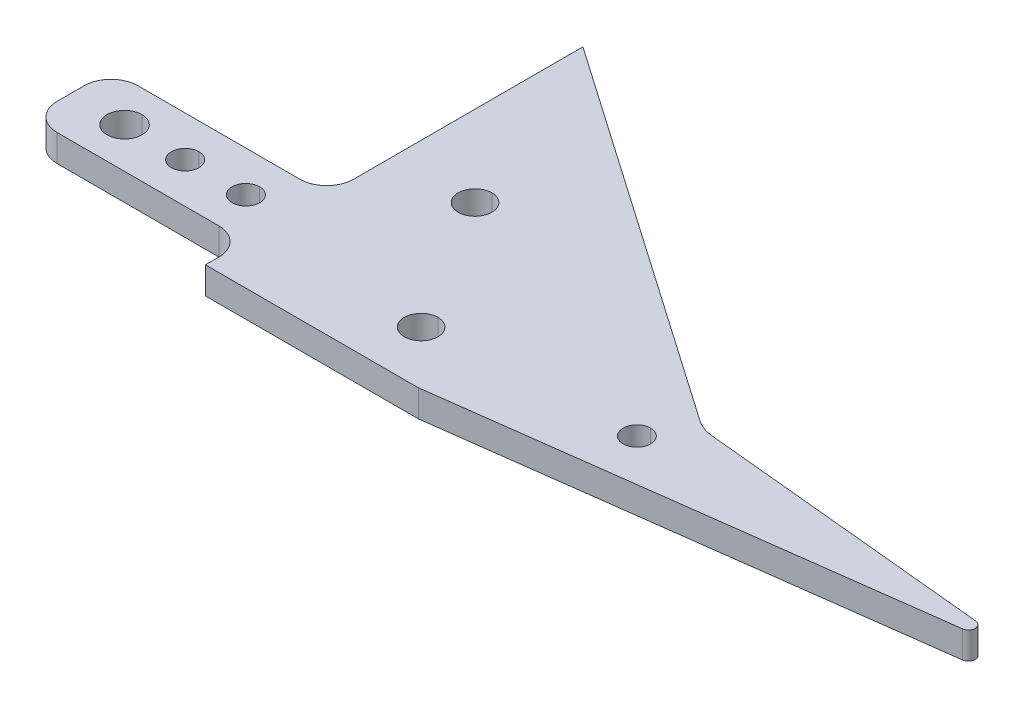
ISO-10303-21;
HEADER;
FILE_DESCRIPTION(('STEP AP214'),'2;1');
FILE_NAME('part.step','',(''),(''),'','','');
FILE_SCHEMA(('AUTOMOTIVE_DESIGN { 1 0 10303 214 1 1 1 1 }'));
ENDSEC;
DATA;
#1=APPLICATION_CONTEXT('core data for automotive mechanical design processes');
#2=APPLICATION_PROTOCOL_DEFINITION('international standard','automotive_design',2000,#1);
#3=PRODUCT_CONTEXT('',#1,'mechanical');
#4=PRODUCT('Part','Part','',(#3));
#5=PRODUCT_RELATED_PRODUCT_CATEGORY('part','',(#4));
#6=PRODUCT_DEFINITION_FORMATION('','',#4);
#7=PRODUCT_DEFINITION_CONTEXT('part definition',#1,'design');
#8=PRODUCT_DEFINITION('design','',#6,#7);
#9=PRODUCT_DEFINITION_SHAPE('','',#8);
#10=(LENGTH_UNIT() NAMED_UNIT(*) SI_UNIT(.MILLI.,.METRE.));
#11=(NAMED_UNIT(*) PLANE_ANGLE_UNIT() SI_UNIT($,.RADIAN.));
#12=(NAMED_UNIT(*) SI_UNIT($,.STERADIAN.) SOLID_ANGLE_UNIT());
#13=UNCERTAINTY_MEASURE_WITH_UNIT(LENGTH_MEASURE(1.E-05),#10,'distance_accuracy_value','');
#14=(GEOMETRIC_REPRESENTATION_CONTEXT(3) GLOBAL_UNCERTAINTY_ASSIGNED_CONTEXT((#13)) GLOBAL_UNIT_ASSIGNED_CONTEXT((#10,
#11,#12)) REPRESENTATION_CONTEXT('',''));
#15=CARTESIAN_POINT('',(0.,0.,0.));
#16=DIRECTION('',(0.,0.,1.));
#17=DIRECTION('',(1.,0.,0.));
#18=AXIS2_PLACEMENT_3D('',#15,#16,#17);
#19=CARTESIAN_POINT('',(43.,0.,-6.));
#20=DIRECTION('',(0.,1.,0.));
#21=DIRECTION('',(0.,0.,1.));
#22=AXIS2_PLACEMENT_3D('',#19,#20,#21);
#23=CYLINDRICAL_SURFACE('',#22,1.25);
#24=DIRECTION('',(0.,1.,0.));
#25=VECTOR('',#24,1.);
#26=CARTESIAN_POINT('',(43.,0.,-7.25));
#27=LINE('',#26,#25);
#28=CARTESIAN_POINT('',(43.,0.,-7.25));
#29=VERTEX_POINT('',#28);
#30=CARTESIAN_POINT('',(43.,2.,-7.25));
#31=VERTEX_POINT('',#30);
#32=EDGE_CURVE('E272',#29,#31,#27,.T.);
#33=ORIENTED_EDGE('',*,*,#32,.F.);
#34=CARTESIAN_POINT('',(43.,0.,-6.));
#35=DIRECTION('',(0.,1.,0.));
#36=DIRECTION('',(0.,0.,1.));
#37=AXIS2_PLACEMENT_3D('',#34,#35,#36);
#38=CIRCLE('',#37,1.25);
#39=CARTESIAN_POINT('',(43.,0.,-4.75));
#40=VERTEX_POINT('',#39);
#41=EDGE_CURVE('E259',#40,#29,#38,.T.);
#42=ORIENTED_EDGE('',*,*,#41,.F.);
#43=DIRECTION('',(0.,1.,0.));
#44=VECTOR('',#43,1.);
#45=CARTESIAN_POINT('',(43.,0.,-4.75));
#46=LINE('',#45,#44);
#47=CARTESIAN_POINT('',(43.,2.,-4.75));
#48=VERTEX_POINT('',#47);
#49=EDGE_CURVE('E281',#40,#48,#46,.T.);
#50=ORIENTED_EDGE('',*,*,#49,.T.);
#51=CARTESIAN_POINT('',(43.,2.,-6.));
#52=DIRECTION('',(0.,1.,0.));
#53=DIRECTION('',(0.,0.,1.));
#54=AXIS2_PLACEMENT_3D('',#51,#52,#53);
#55=CIRCLE('',#54,1.25);
#56=EDGE_CURVE('E273',#48,#31,#55,.T.);
#57=ORIENTED_EDGE('',*,*,#56,.T.);
#58=EDGE_LOOP('',(#33,#42,#50,#57));
#59=FACE_BOUND('',#58,.T.);
#60=ADVANCED_FACE('F16',(#59),#23,.F.);
#61=CARTESIAN_POINT('',(23.5,2.,-8.));
#62=DIRECTION('',(0.,1.,0.));
#63=DIRECTION('',(0.,0.,1.));
#64=AXIS2_PLACEMENT_3D('',#61,#62,#63);
#65=CYLINDRICAL_SURFACE('',#64,1.025);
#66=DIRECTION('',(0.,1.,0.));
#67=VECTOR('',#66,1.);
#68=CARTESIAN_POINT('',(23.5,2.,-9.025));
#69=LINE('',#68,#67);
#70=CARTESIAN_POINT('',(23.5,0.,-9.025));
#71=VERTEX_POINT('',#70);
#72=CARTESIAN_POINT('',(23.5,2.,-9.025));
#73=VERTEX_POINT('',#72);
#74=EDGE_CURVE('E308',#71,#73,#69,.T.);
#75=ORIENTED_EDGE('',*,*,#74,.F.);
#76=CARTESIAN_POINT('',(23.5,0.,-8.));
#77=DIRECTION('',(0.,-1.,0.));
#78=DIRECTION('',(0.,0.,-1.));
#79=AXIS2_PLACEMENT_3D('',#76,#77,#78);
#80=CIRCLE('',#79,1.025);
#81=CARTESIAN_POINT('',(23.5,0.,-6.975));
#82=VERTEX_POINT('',#81);
#83=EDGE_CURVE('E288',#71,#82,#80,.T.);
#84=ORIENTED_EDGE('',*,*,#83,.T.);
#85=DIRECTION('',(0.,1.,0.));
#86=VECTOR('',#85,1.);
#87=CARTESIAN_POINT('',(23.5,2.,-6.975));
#88=LINE('',#87,#86);
#89=CARTESIAN_POINT('',(23.5,2.,-6.975));
#90=VERTEX_POINT('',#89);
#91=EDGE_CURVE('E307',#82,#90,#88,.T.);
#92=ORIENTED_EDGE('',*,*,#91,.T.);
#93=CARTESIAN_POINT('',(23.5,2.,-8.));
#94=DIRECTION('',(0.,1.,0.));
#95=DIRECTION('',(0.,0.,1.));
#96=AXIS2_PLACEMENT_3D('',#93,#94,#95);
#97=CIRCLE('',#96,1.02499999999999);
#98=EDGE_CURVE('E480',#90,#73,#97,.T.);
#99=ORIENTED_EDGE('',*,*,#98,.T.);
#100=EDGE_LOOP('',(#75,#84,#92,#99));
#101=FACE_BOUND('',#100,.T.);
#102=ADVANCED_FACE('F627',(#101),#65,.F.);
#103=CARTESIAN_POINT('',(19.,-8.,-8.));
#104=DIRECTION('',(0.,1.,0.));
#105=DIRECTION('',(0.,0.,1.));
#106=AXIS2_PLACEMENT_3D('',#103,#104,#105);
#107=CYLINDRICAL_SURFACE('',#106,1.3);
#108=DIRECTION('',(0.,1.,0.));
#109=VECTOR('',#108,1.);
#110=CARTESIAN_POINT('',(19.,-8.,-9.3));
#111=LINE('',#110,#109);
#112=CARTESIAN_POINT('',(19.,0.,-9.3));
#113=VERTEX_POINT('',#112);
#114=CARTESIAN_POINT('',(19.,2.,-9.3));
#115=VERTEX_POINT('',#114);
#116=EDGE_CURVE('E361',#113,#115,#111,.T.);
#117=ORIENTED_EDGE('',*,*,#116,.F.);
#118=CARTESIAN_POINT('',(19.,0.,-8.));
#119=DIRECTION('',(0.,-1.,0.));
#120=DIRECTION('',(0.,0.,-1.));
#121=AXIS2_PLACEMENT_3D('',#118,#119,#120);
#122=CIRCLE('',#121,1.3);
#123=CARTESIAN_POINT('',(19.,0.,-6.7));
#124=VERTEX_POINT('',#123);
#125=EDGE_CURVE('E291',#113,#124,#122,.T.);
#126=ORIENTED_EDGE('',*,*,#125,.T.);
#127=DIRECTION('',(0.,1.,0.));
#128=VECTOR('',#127,1.);
#129=CARTESIAN_POINT('',(19.,-8.,-6.7));
#130=LINE('',#129,#128);
#131=CARTESIAN_POINT('',(19.,2.,-6.7));
#132=VERTEX_POINT('',#131);
#133=EDGE_CURVE('E330',#124,#132,#130,.T.);
#134=ORIENTED_EDGE('',*,*,#133,.T.);
#135=CARTESIAN_POINT('',(19.,2.,-8.));
#136=DIRECTION('',(0.,1.,0.));
#137=DIRECTION('',(0.,0.,1.));
#138=AXIS2_PLACEMENT_3D('',#135,#136,#137);
#139=CIRCLE('',#138,1.3);
#140=EDGE_CURVE('E483',#132,#115,#139,.T.);
#141=ORIENTED_EDGE('',*,*,#140,.T.);
#142=EDGE_LOOP('',(#117,#126,#134,#141));
#143=FACE_BOUND('',#142,.T.);
#144=ADVANCED_FACE('F631',(#143),#107,.F.);
#145=CARTESIAN_POINT('',(61.063887788256,2.,-12.7905388234197));
#146=DIRECTION('',(0.,1.,0.));
#147=DIRECTION('',(0.,0.,1.));
#148=AXIS2_PLACEMENT_3D('',#145,#146,#147);
#149=CYLINDRICAL_SURFACE('',#148,3.);
#150=CARTESIAN_POINT('',(61.063887788256,2.,-12.7905388234197));
#151=DIRECTION('',(0.,-1.,0.));
#152=DIRECTION('',(0.,0.,-1.));
#153=AXIS2_PLACEMENT_3D('',#150,#151,#152);
#154=CIRCLE('',#153,3.);
#155=CARTESIAN_POINT('',(60.7726376251566,2.,-9.80471007037729));
#156=VERTEX_POINT('',#155);
#157=CARTESIAN_POINT('',(59.3536273564194,2.,-10.3257854371163));
#158=VERTEX_POINT('',#157);
#159=EDGE_CURVE('E463',#156,#158,#154,.T.);
#160=ORIENTED_EDGE('',*,*,#159,.F.);
#161=DIRECTION('',(0.,1.,0.));
#162=VECTOR('',#161,1.);
#163=CARTESIAN_POINT('',(60.7726376251566,2.,-9.80471007037729));
#164=LINE('',#163,#162);
#165=CARTESIAN_POINT('',(60.7726376251566,0.,-9.80471007037729));
#166=VERTEX_POINT('',#165);
#167=EDGE_CURVE('E25',#166,#156,#164,.T.);
#168=ORIENTED_EDGE('',*,*,#167,.F.);
#169=CARTESIAN_POINT('',(61.063887788256,0.,-12.7905388234197));
#170=DIRECTION('',(0.,1.,0.));
#171=DIRECTION('',(0.,0.,-1.));
#172=AXIS2_PLACEMENT_3D('',#169,#170,#171);
#173=CIRCLE('',#172,3.);
#174=CARTESIAN_POINT('',(59.3536273564194,0.,-10.3257854371163));
#175=VERTEX_POINT('',#174);
#176=EDGE_CURVE('E292',#175,#166,#173,.T.);
#177=ORIENTED_EDGE('',*,*,#176,.F.);
#178=DIRECTION('',(0.,-1.,0.));
#179=VECTOR('',#178,1.);
#180=CARTESIAN_POINT('',(59.3536273564194,0.,-10.3257854371163));
#181=LINE('',#180,#179);
#182=EDGE_CURVE('E410',#158,#175,#181,.T.);
#183=ORIENTED_EDGE('',*,*,#182,.F.);
#184=EDGE_LOOP('',(#160,#168,#177,#183));
#185=FACE_BOUND('',#184,.T.);
#186=ADVANCED_FACE('F601',(#185),#149,.F.);
#187=CARTESIAN_POINT('',(82.4056334382696,31.0427436613577,-7.19216454145171));
#188=DIRECTION('',(0.,-1.,0.));
#189=DIRECTION('',(0.,0.,-1.));
#190=AXIS2_PLACEMENT_3D('',#187,#188,#189);
#191=CYLINDRICAL_SURFACE('',#190,0.5);
#192=CARTESIAN_POINT('',(82.4056334382696,2.,-7.19216454145171));
#193=DIRECTION('',(0.,1.,0.));
#194=DIRECTION('',(0.,0.,-1.));
#195=AXIS2_PLACEMENT_3D('',#192,#193,#194);
#196=CIRCLE('',#195,0.5);
#197=CARTESIAN_POINT('',(82.4708965343796,2.,-6.6964421107648));
#198=VERTEX_POINT('',#197);
#199=CARTESIAN_POINT('',(82.4541751321195,2.,-7.68980266695877));
#200=VERTEX_POINT('',#199);
#201=EDGE_CURVE('E445',#198,#200,#196,.T.);
#202=ORIENTED_EDGE('',*,*,#201,.F.);
#203=DIRECTION('',(0.,1.,0.));
#204=VECTOR('',#203,1.);
#205=CARTESIAN_POINT('',(82.4708965343796,2.,-6.69644211076481));
#206=LINE('',#205,#204);
#207=CARTESIAN_POINT('',(82.4708965343796,0.,-6.6964421107648));
#208=VERTEX_POINT('',#207);
#209=EDGE_CURVE('E510',#208,#198,#206,.T.);
#210=ORIENTED_EDGE('',*,*,#209,.F.);
#211=CARTESIAN_POINT('',(82.4056334382696,0.,-7.19216454145171));
#212=DIRECTION('',(0.,-1.,0.));
#213=DIRECTION('',(0.,0.,-1.));
#214=AXIS2_PLACEMENT_3D('',#211,#212,#213);
#215=CIRCLE('',#214,0.5);
#216=CARTESIAN_POINT('',(82.4541751321195,0.,-7.68980266695877));
#217=VERTEX_POINT('',#216);
#218=EDGE_CURVE('E522',#217,#208,#215,.T.);
#219=ORIENTED_EDGE('',*,*,#218,.F.);
#220=DIRECTION('',(0.,-1.,0.));
#221=VECTOR('',#220,1.);
#222=CARTESIAN_POINT('',(82.4541751321195,31.0427436613577,-7.68980266695877));
#223=LINE('',#222,#221);
#224=EDGE_CURVE('E11',#200,#217,#223,.T.);
#225=ORIENTED_EDGE('',*,*,#224,.F.);
#226=EDGE_LOOP('',(#202,#210,#219,#225));
#227=FACE_BOUND('',#226,.T.);
#228=ADVANCED_FACE('F595',(#227),#191,.T.);
#229=CARTESIAN_POINT('',(1.52017135493674,31.0427436613577,-15.5844422293835));
#230=DIRECTION('',(-0.0970833876998076,0.,0.995276251014124));
#231=DIRECTION('',(0.,1.,0.));
#232=AXIS2_PLACEMENT_3D('',#229,#230,#231);
#233=PLANE('',#232);
#234=DIRECTION('',(-0.995276251014124,0.,-0.0970833876998076));
#235=VECTOR('',#234,1.);
#236=CARTESIAN_POINT('',(1.52017135493674,0.,-15.5844422293835));
#237=LINE('',#236,#235);
#238=EDGE_CURVE('E518',#217,#166,#237,.T.);
#239=ORIENTED_EDGE('',*,*,#238,.T.);
#240=ORIENTED_EDGE('',*,*,#167,.T.);
#241=DIRECTION('',(0.995276251014124,0.,0.0970833876998076));
#242=VECTOR('',#241,1.);
#243=CARTESIAN_POINT('',(1.52017135493674,2.,-15.5844422293835));
#244=LINE('',#243,#242);
#245=EDGE_CURVE('E449',#156,#200,#244,.T.);
#246=ORIENTED_EDGE('',*,*,#245,.T.);
#247=ORIENTED_EDGE('',*,*,#224,.T.);
#248=EDGE_LOOP('',(#239,#240,#246,#247));
#249=FACE_BOUND('',#248,.T.);
#250=ADVANCED_FACE('F599',(#249),#233,.F.);
#251=CARTESIAN_POINT('',(28.,0.,-8.));
#252=DIRECTION('',(0.,-1.,0.));
#253=DIRECTION('',(0.,0.,-1.));
#254=AXIS2_PLACEMENT_3D('',#251,#252,#253);
#255=CYLINDRICAL_SURFACE('',#254,1.025);
#256=DIRECTION('',(0.,-1.,0.));
#257=VECTOR('',#256,1.);
#258=CARTESIAN_POINT('',(28.,0.,-6.975));
#259=LINE('',#258,#257);
#260=CARTESIAN_POINT('',(28.,2.,-6.975));
#261=VERTEX_POINT('',#260);
#262=CARTESIAN_POINT('',(28.,0.,-6.975));
#263=VERTEX_POINT('',#262);
#264=EDGE_CURVE('E329',#261,#263,#259,.T.);
#265=ORIENTED_EDGE('',*,*,#264,.F.);
#266=CARTESIAN_POINT('',(28.,2.,-8.));
#267=DIRECTION('',(0.,-1.,0.));
#268=DIRECTION('',(0.,0.,-1.));
#269=AXIS2_PLACEMENT_3D('',#266,#267,#268);
#270=CIRCLE('',#269,1.025);
#271=CARTESIAN_POINT('',(28.,2.,-9.025));
#272=VERTEX_POINT('',#271);
#273=EDGE_CURVE('E495',#272,#261,#270,.T.);
#274=ORIENTED_EDGE('',*,*,#273,.F.);
#275=DIRECTION('',(0.,-1.,0.));
#276=VECTOR('',#275,1.);
#277=CARTESIAN_POINT('',(28.,0.,-9.025));
#278=LINE('',#277,#276);
#279=CARTESIAN_POINT('',(28.,0.,-9.025));
#280=VERTEX_POINT('',#279);
#281=EDGE_CURVE('E338',#272,#280,#278,.T.);
#282=ORIENTED_EDGE('',*,*,#281,.T.);
#283=CARTESIAN_POINT('',(28.,0.,-8.));
#284=DIRECTION('',(0.,-1.,0.));
#285=DIRECTION('',(0.,0.,-1.));
#286=AXIS2_PLACEMENT_3D('',#283,#284,#285);
#287=CIRCLE('',#286,1.025);
#288=EDGE_CURVE('E540',#280,#263,#287,.T.);
#289=ORIENTED_EDGE('',*,*,#288,.T.);
#290=EDGE_LOOP('',(#265,#274,#282,#289));
#291=FACE_BOUND('',#290,.T.);
#292=ADVANCED_FACE('F646',(#291),#255,.F.);
#293=CARTESIAN_POINT('',(29.,19.0880074906351,-13.));
#294=DIRECTION('',(0.,-1.,0.));
#295=DIRECTION('',(0.,0.,-1.));
#296=AXIS2_PLACEMENT_3D('',#293,#294,#295);
#297=CYLINDRICAL_SURFACE('',#296,2.);
#298=CARTESIAN_POINT('',(29.,2.,-13.));
#299=DIRECTION('',(0.,-1.,0.));
#300=DIRECTION('',(0.,0.,-1.));
#301=AXIS2_PLACEMENT_3D('',#298,#299,#300);
#302=CIRCLE('',#301,2.);
#303=CARTESIAN_POINT('',(31.,2.,-13.));
#304=VERTEX_POINT('',#303);
#305=CARTESIAN_POINT('',(29.,2.,-11.));
#306=VERTEX_POINT('',#305);
#307=EDGE_CURVE('E459',#304,#306,#302,.T.);
#308=ORIENTED_EDGE('',*,*,#307,.F.);
#309=DIRECTION('',(0.,1.,0.));
#310=VECTOR('',#309,1.);
#311=CARTESIAN_POINT('',(31.,1.,-13.));
#312=LINE('',#311,#310);
#313=CARTESIAN_POINT('',(31.,0.,-13.));
#314=VERTEX_POINT('',#313);
#315=EDGE_CURVE('E389',#314,#304,#312,.T.);
#316=ORIENTED_EDGE('',*,*,#315,.F.);
#317=CARTESIAN_POINT('',(29.,0.,-13.));
#318=DIRECTION('',(0.,1.,0.));
#319=DIRECTION('',(0.,0.,-1.));
#320=AXIS2_PLACEMENT_3D('',#317,#318,#319);
#321=CIRCLE('',#320,2.);
#322=CARTESIAN_POINT('',(29.,0.,-11.));
#323=VERTEX_POINT('',#322);
#324=EDGE_CURVE('E293',#323,#314,#321,.T.);
#325=ORIENTED_EDGE('',*,*,#324,.F.);
#326=DIRECTION('',(0.,-1.,0.));
#327=VECTOR('',#326,1.);
#328=CARTESIAN_POINT('',(29.,19.0880074906351,-11.));
#329=LINE('',#328,#327);
#330=EDGE_CURVE('E39',#306,#323,#329,.T.);
#331=ORIENTED_EDGE('',*,*,#330,.F.);
#332=EDGE_LOOP('',(#308,#316,#325,#331));
#333=FACE_BOUND('',#332,.T.);
#334=ADVANCED_FACE('F613',(#333),#297,.F.);
#335=CARTESIAN_POINT('',(29.,1.,-3.));
#336=DIRECTION('',(0.,-1.,0.));
#337=DIRECTION('',(0.,0.,-1.));
#338=AXIS2_PLACEMENT_3D('',#335,#336,#337);
#339=CYLINDRICAL_SURFACE('',#338,2.);
#340=CARTESIAN_POINT('',(29.,2.,-3.));
#341=DIRECTION('',(0.,-1.,0.));
#342=DIRECTION('',(0.,0.,-1.));
#343=AXIS2_PLACEMENT_3D('',#340,#341,#342);
#344=CIRCLE('',#343,2.);
#345=CARTESIAN_POINT('',(29.,2.,-5.));
#346=VERTEX_POINT('',#345);
#347=CARTESIAN_POINT('',(31.,2.,-3.));
#348=VERTEX_POINT('',#347);
#349=EDGE_CURVE('E351',#346,#348,#344,.T.);
#350=ORIENTED_EDGE('',*,*,#349,.F.);
#351=DIRECTION('',(0.,1.,0.));
#352=VECTOR('',#351,1.);
#353=CARTESIAN_POINT('',(29.,19.0880074906351,-5.));
#354=LINE('',#353,#352);
#355=CARTESIAN_POINT('',(29.,0.,-5.));
#356=VERTEX_POINT('',#355);
#357=EDGE_CURVE('E19',#356,#346,#354,.T.);
#358=ORIENTED_EDGE('',*,*,#357,.F.);
#359=CARTESIAN_POINT('',(29.,0.,-3.));
#360=DIRECTION('',(0.,1.,0.));
#361=DIRECTION('',(0.,0.,-1.));
#362=AXIS2_PLACEMENT_3D('',#359,#360,#361);
#363=CIRCLE('',#362,2.);
#364=CARTESIAN_POINT('',(31.,0.,-3.));
#365=VERTEX_POINT('',#364);
#366=EDGE_CURVE('E409',#365,#356,#363,.T.);
#367=ORIENTED_EDGE('',*,*,#366,.F.);
#368=DIRECTION('',(0.,-1.,0.));
#369=VECTOR('',#368,1.);
#370=CARTESIAN_POINT('',(31.,1.,-3.));
#371=LINE('',#370,#369);
#372=EDGE_CURVE('E297',#348,#365,#371,.T.);
#373=ORIENTED_EDGE('',*,*,#372,.F.);
#374=EDGE_LOOP('',(#350,#358,#367,#373));
#375=FACE_BOUND('',#374,.T.);
#376=ADVANCED_FACE('F581',(#375),#339,.F.);
#377=CARTESIAN_POINT('',(17.,19.0880074906351,-7.));
#378=DIRECTION('',(0.,-1.,0.));
#379=DIRECTION('',(0.,0.,-1.));
#380=AXIS2_PLACEMENT_3D('',#377,#378,#379);
#381=CYLINDRICAL_SURFACE('',#380,2.);
#382=CARTESIAN_POINT('',(17.,2.,-7.));
#383=DIRECTION('',(0.,1.,0.));
#384=DIRECTION('',(0.,0.,-1.));
#385=AXIS2_PLACEMENT_3D('',#382,#383,#384);
#386=CIRCLE('',#385,2.);
#387=CARTESIAN_POINT('',(15.,2.,-7.));
#388=VERTEX_POINT('',#387);
#389=CARTESIAN_POINT('',(17.,2.,-5.));
#390=VERTEX_POINT('',#389);
#391=EDGE_CURVE('E352',#388,#390,#386,.T.);
#392=ORIENTED_EDGE('',*,*,#391,.F.);
#393=DIRECTION('',(0.,1.,0.));
#394=VECTOR('',#393,1.);
#395=CARTESIAN_POINT('',(15.,19.0880074906351,-7.));
#396=LINE('',#395,#394);
#397=CARTESIAN_POINT('',(15.,0.,-7.));
#398=VERTEX_POINT('',#397);
#399=EDGE_CURVE('E530',#398,#388,#396,.T.);
#400=ORIENTED_EDGE('',*,*,#399,.F.);
#401=CARTESIAN_POINT('',(17.,0.,-7.));
#402=DIRECTION('',(0.,-1.,0.));
#403=DIRECTION('',(0.,0.,-1.));
#404=AXIS2_PLACEMENT_3D('',#401,#402,#403);
#405=CIRCLE('',#404,2.);
#406=CARTESIAN_POINT('',(17.,0.,-5.));
#407=VERTEX_POINT('',#406);
#408=EDGE_CURVE('E408',#407,#398,#405,.T.);
#409=ORIENTED_EDGE('',*,*,#408,.F.);
#410=DIRECTION('',(0.,-1.,0.));
#411=VECTOR('',#410,1.);
#412=CARTESIAN_POINT('',(17.,19.0880074906351,-5.));
#413=LINE('',#412,#411);
#414=EDGE_CURVE('E534',#390,#407,#413,.T.);
#415=ORIENTED_EDGE('',*,*,#414,.F.);
#416=EDGE_LOOP('',(#392,#400,#409,#415));
#417=FACE_BOUND('',#416,.T.);
#418=ADVANCED_FACE('F566',(#417),#381,.T.);
#419=CARTESIAN_POINT('',(17.,19.0880074906351,-9.));
#420=DIRECTION('',(0.,-1.,0.));
#421=DIRECTION('',(0.,0.,-1.));
#422=AXIS2_PLACEMENT_3D('',#419,#420,#421);
#423=CYLINDRICAL_SURFACE('',#422,2.);
#424=CARTESIAN_POINT('',(17.,2.,-9.));
#425=DIRECTION('',(0.,1.,0.));
#426=DIRECTION('',(0.,0.,-1.));
#427=AXIS2_PLACEMENT_3D('',#424,#425,#426);
#428=CIRCLE('',#427,2.);
#429=CARTESIAN_POINT('',(17.,2.,-11.));
#430=VERTEX_POINT('',#429);
#431=CARTESIAN_POINT('',(15.,2.,-9.));
#432=VERTEX_POINT('',#431);
#433=EDGE_CURVE('E458',#430,#432,#428,.T.);
#434=ORIENTED_EDGE('',*,*,#433,.F.);
#435=DIRECTION('',(0.,1.,0.));
#436=VECTOR('',#435,1.);
#437=CARTESIAN_POINT('',(17.,19.0880074906351,-11.));
#438=LINE('',#437,#436);
#439=CARTESIAN_POINT('',(17.,0.,-11.));
#440=VERTEX_POINT('',#439);
#441=EDGE_CURVE('E50',#440,#430,#438,.T.);
#442=ORIENTED_EDGE('',*,*,#441,.F.);
#443=CARTESIAN_POINT('',(17.,0.,-9.));
#444=DIRECTION('',(0.,-1.,0.));
#445=DIRECTION('',(0.,0.,-1.));
#446=AXIS2_PLACEMENT_3D('',#443,#444,#445);
#447=CIRCLE('',#446,2.);
#448=CARTESIAN_POINT('',(15.,0.,-9.));
#449=VERTEX_POINT('',#448);
#450=EDGE_CURVE('E365',#449,#440,#447,.T.);
#451=ORIENTED_EDGE('',*,*,#450,.F.);
#452=DIRECTION('',(0.,-1.,0.));
#453=VECTOR('',#452,1.);
#454=CARTESIAN_POINT('',(15.,19.0880074906351,-9.));
#455=LINE('',#454,#453);
#456=EDGE_CURVE('E527',#432,#449,#455,.T.);
#457=ORIENTED_EDGE('',*,*,#456,.F.);
#458=EDGE_LOOP('',(#434,#442,#451,#457));
#459=FACE_BOUND('',#458,.T.);
#460=ADVANCED_FACE('F570',(#459),#423,.T.);
#461=CARTESIAN_POINT('',(31.,19.0880074906351,-5.));
#462=DIRECTION('',(0.,0.,1.));
#463=DIRECTION('',(1.,0.,0.));
#464=AXIS2_PLACEMENT_3D('',#461,#462,#463);
#465=PLANE('',#464);
#466=DIRECTION('',(1.,0.,0.));
#467=VECTOR('',#466,1.);
#468=CARTESIAN_POINT('',(31.,2.,-5.));
#469=LINE('',#468,#467);
#470=EDGE_CURVE('E347',#390,#346,#469,.T.);
#471=ORIENTED_EDGE('',*,*,#470,.F.);
#472=ORIENTED_EDGE('',*,*,#414,.T.);
#473=DIRECTION('',(-1.,0.,0.));
#474=VECTOR('',#473,1.);
#475=CARTESIAN_POINT('',(31.,0.,-5.));
#476=LINE('',#475,#474);
#477=EDGE_CURVE('E404',#356,#407,#476,.T.);
#478=ORIENTED_EDGE('',*,*,#477,.F.);
#479=ORIENTED_EDGE('',*,*,#357,.T.);
#480=EDGE_LOOP('',(#471,#472,#478,#479));
#481=FACE_BOUND('',#480,.T.);
#482=ADVANCED_FACE('F576',(#481),#465,.T.);
#483=CARTESIAN_POINT('',(15.,19.0880074906351,-5.));
#484=DIRECTION('',(-1.,0.,0.));
#485=DIRECTION('',(0.,0.,1.));
#486=AXIS2_PLACEMENT_3D('',#483,#484,#485);
#487=PLANE('',#486);
#488=DIRECTION('',(0.,0.,1.));
#489=VECTOR('',#488,1.);
#490=CARTESIAN_POINT('',(15.,2.,-5.));
#491=LINE('',#490,#489);
#492=EDGE_CURVE('E476',#432,#388,#491,.T.);
#493=ORIENTED_EDGE('',*,*,#492,.F.);
#494=ORIENTED_EDGE('',*,*,#456,.T.);
#495=DIRECTION('',(0.,0.,-1.));
#496=VECTOR('',#495,1.);
#497=CARTESIAN_POINT('',(15.,0.,-5.));
#498=LINE('',#497,#496);
#499=EDGE_CURVE('E453',#398,#449,#498,.T.);
#500=ORIENTED_EDGE('',*,*,#499,.F.);
#501=ORIENTED_EDGE('',*,*,#399,.T.);
#502=EDGE_LOOP('',(#493,#494,#500,#501));
#503=FACE_BOUND('',#502,.T.);
#504=ADVANCED_FACE('F563',(#503),#487,.T.);
#505=CARTESIAN_POINT('',(31.,19.0880074906351,-11.));
#506=DIRECTION('',(0.,0.,-1.));
#507=DIRECTION('',(0.,-1.,0.));
#508=AXIS2_PLACEMENT_3D('',#505,#506,#507);
#509=PLANE('',#508);
#510=DIRECTION('',(1.,0.,0.));
#511=VECTOR('',#510,1.);
#512=CARTESIAN_POINT('',(31.,0.,-11.));
#513=LINE('',#512,#511);
#514=EDGE_CURVE('E295',#440,#323,#513,.T.);
#515=ORIENTED_EDGE('',*,*,#514,.F.);
#516=ORIENTED_EDGE('',*,*,#441,.T.);
#517=DIRECTION('',(-1.,0.,0.));
#518=VECTOR('',#517,1.);
#519=CARTESIAN_POINT('',(31.,2.,-11.));
#520=LINE('',#519,#518);
#521=EDGE_CURVE('E454',#306,#430,#520,.T.);
#522=ORIENTED_EDGE('',*,*,#521,.F.);
#523=ORIENTED_EDGE('',*,*,#330,.T.);
#524=EDGE_LOOP('',(#515,#516,#522,#523));
#525=FACE_BOUND('',#524,.T.);
#526=ADVANCED_FACE('F614',(#525),#509,.T.);
#527=CARTESIAN_POINT('',(57.7420724848817,8.,-2.));
#528=DIRECTION('',(0.,0.,-1.));
#529=DIRECTION('',(0.,-1.,0.));
#530=AXIS2_PLACEMENT_3D('',#527,#528,#529);
#531=PLANE('',#530);
#532=DIRECTION('',(1.,0.,0.));
#533=VECTOR('',#532,1.);
#534=CARTESIAN_POINT('',(58.,2.,-2.));
#535=LINE('',#534,#533);
#536=CARTESIAN_POINT('',(31.,2.,-2.));
#537=VERTEX_POINT('',#536);
#538=CARTESIAN_POINT('',(46.7978770563626,2.,-2.));
#539=VERTEX_POINT('',#538);
#540=EDGE_CURVE('E484',#537,#539,#535,.T.);
#541=ORIENTED_EDGE('',*,*,#540,.F.);
#542=DIRECTION('',(0.,-1.,0.));
#543=VECTOR('',#542,1.);
#544=CARTESIAN_POINT('',(31.,2.,-2.));
#545=LINE('',#544,#543);
#546=CARTESIAN_POINT('',(31.,0.,-2.));
#547=VERTEX_POINT('',#546);
#548=EDGE_CURVE('E437',#537,#547,#545,.T.);
#549=ORIENTED_EDGE('',*,*,#548,.T.);
#550=DIRECTION('',(1.,0.,0.));
#551=VECTOR('',#550,1.);
#552=CARTESIAN_POINT('',(58.,0.,-2.));
#553=LINE('',#552,#551);
#554=CARTESIAN_POINT('',(46.7978770563625,0.,-2.));
#555=VERTEX_POINT('',#554);
#556=EDGE_CURVE('E433',#547,#555,#553,.T.);
#557=ORIENTED_EDGE('',*,*,#556,.T.);
#558=DIRECTION('',(0.,-1.,0.));
#559=VECTOR('',#558,1.);
#560=CARTESIAN_POINT('',(46.7978770563626,2.,-2.));
#561=LINE('',#560,#559);
#562=EDGE_CURVE('E415',#539,#555,#561,.T.);
#563=ORIENTED_EDGE('',*,*,#562,.F.);
#564=EDGE_LOOP('',(#541,#549,#557,#563));
#565=FACE_BOUND('',#564,.T.);
#566=ADVANCED_FACE('F586',(#565),#531,.F.);
#567=CARTESIAN_POINT('',(58.,-0.53,-7.00498882584149));
#568=DIRECTION('',(0.,1.,0.));
#569=DIRECTION('',(0.,0.,1.));
#570=AXIS2_PLACEMENT_3D('',#567,#568,#569);
#571=CYLINDRICAL_SURFACE('',#570,1.02);
#572=CARTESIAN_POINT('',(58.,0.,-7.00498882584149));
#573=DIRECTION('',(0.,-1.,0.));
#574=DIRECTION('',(0.,0.,-1.));
#575=AXIS2_PLACEMENT_3D('',#572,#573,#574);
#576=CIRCLE('',#575,1.02);
#577=CARTESIAN_POINT('',(58.,0.,-5.98498882584149));
#578=VERTEX_POINT('',#577);
#579=CARTESIAN_POINT('',(58.,0.,-8.02498882584149));
#580=VERTEX_POINT('',#579);
#581=EDGE_CURVE('E269',#578,#580,#576,.T.);
#582=ORIENTED_EDGE('',*,*,#581,.T.);
#583=DIRECTION('',(0.,1.,0.));
#584=VECTOR('',#583,1.);
#585=CARTESIAN_POINT('',(58.,-0.53,-8.02498882584149));
#586=LINE('',#585,#584);
#587=CARTESIAN_POINT('',(58.,2.,-8.02498882584149));
#588=VERTEX_POINT('',#587);
#589=EDGE_CURVE('E324',#580,#588,#586,.T.);
#590=ORIENTED_EDGE('',*,*,#589,.T.);
#591=CARTESIAN_POINT('',(58.,2.,-7.00498882584149));
#592=DIRECTION('',(0.,1.,0.));
#593=DIRECTION('',(0.,0.,1.));
#594=AXIS2_PLACEMENT_3D('',#591,#592,#593);
#595=CIRCLE('',#594,1.02);
#596=CARTESIAN_POINT('',(58.,2.,-5.98498882584149));
#597=VERTEX_POINT('',#596);
#598=EDGE_CURVE('E501',#588,#597,#595,.T.);
#599=ORIENTED_EDGE('',*,*,#598,.T.);
#600=DIRECTION('',(0.,1.,0.));
#601=VECTOR('',#600,1.);
#602=CARTESIAN_POINT('',(58.,-0.53,-5.98498882584149));
#603=LINE('',#602,#601);
#604=EDGE_CURVE('E323',#578,#597,#603,.T.);
#605=ORIENTED_EDGE('',*,*,#604,.F.);
#606=EDGE_LOOP('',(#582,#590,#599,#605));
#607=FACE_BOUND('',#606,.T.);
#608=ADVANCED_FACE('F622',(#607),#571,.F.);
#609=CARTESIAN_POINT('',(37.,-8.,-16.0000000000005));
#610=DIRECTION('',(0.,1.,0.));
#611=DIRECTION('',(0.,0.,1.));
#612=AXIS2_PLACEMENT_3D('',#609,#610,#611);
#613=CYLINDRICAL_SURFACE('',#612,1.25);
#614=CARTESIAN_POINT('',(37.,0.,-16.0000000000005));
#615=DIRECTION('',(0.,-1.,0.));
#616=DIRECTION('',(0.,0.,-1.));
#617=AXIS2_PLACEMENT_3D('',#614,#615,#616);
#618=CIRCLE('',#617,1.25);
#619=CARTESIAN_POINT('',(37.,0.,-14.7500000000005));
#620=VERTEX_POINT('',#619);
#621=CARTESIAN_POINT('',(37.,0.,-17.2500000000005));
#622=VERTEX_POINT('',#621);
#623=EDGE_CURVE('E543',#620,#622,#618,.T.);
#624=ORIENTED_EDGE('',*,*,#623,.T.);
#625=DIRECTION('',(0.,1.,0.));
#626=VECTOR('',#625,1.);
#627=CARTESIAN_POINT('',(37.,-8.,-17.2500000000005));
#628=LINE('',#627,#626);
#629=CARTESIAN_POINT('',(37.,2.,-17.2500000000005));
#630=VERTEX_POINT('',#629);
#631=EDGE_CURVE('E399',#622,#630,#628,.T.);
#632=ORIENTED_EDGE('',*,*,#631,.T.);
#633=CARTESIAN_POINT('',(37.,2.,-16.0000000000005));
#634=DIRECTION('',(0.,1.,0.));
#635=DIRECTION('',(0.,0.,1.));
#636=AXIS2_PLACEMENT_3D('',#633,#634,#635);
#637=CIRCLE('',#636,1.25);
#638=CARTESIAN_POINT('',(37.,2.,-14.7500000000005));
#639=VERTEX_POINT('',#638);
#640=EDGE_CURVE('E497',#630,#639,#637,.T.);
#641=ORIENTED_EDGE('',*,*,#640,.T.);
#642=DIRECTION('',(0.,1.,0.));
#643=VECTOR('',#642,1.);
#644=CARTESIAN_POINT('',(37.,-8.,-14.7500000000005));
#645=LINE('',#644,#643);
#646=EDGE_CURVE('E419',#620,#639,#645,.T.);
#647=ORIENTED_EDGE('',*,*,#646,.F.);
#648=EDGE_LOOP('',(#624,#632,#641,#647));
#649=FACE_BOUND('',#648,.T.);
#650=ADVANCED_FACE('F670',(#649),#613,.F.);
#651=CARTESIAN_POINT('',(58.,0.,7.00498882584149));
#652=DIRECTION('',(0.,-1.,0.));
#653=DIRECTION('',(0.,0.,-1.));
#654=AXIS2_PLACEMENT_3D('',#651,#652,#653);
#655=PLANE('',#654);
#656=ORIENTED_EDGE('',*,*,#41,.T.);
#657=CARTESIAN_POINT('',(43.,0.,-6.));
#658=DIRECTION('',(0.,1.,0.));
#659=DIRECTION('',(0.,0.,1.));
#660=AXIS2_PLACEMENT_3D('',#657,#658,#659);
#661=CIRCLE('',#660,1.25);
#662=EDGE_CURVE('E264',#29,#40,#661,.T.);
#663=ORIENTED_EDGE('',*,*,#662,.T.);
#664=EDGE_LOOP('',(#656,#663));
#665=FACE_BOUND('',#664,.T.);
#666=ORIENTED_EDGE('',*,*,#581,.F.);
#667=CARTESIAN_POINT('',(58.,0.,-7.00498882584149));
#668=DIRECTION('',(0.,-1.,0.));
#669=DIRECTION('',(0.,0.,-1.));
#670=AXIS2_PLACEMENT_3D('',#667,#668,#669);
#671=CIRCLE('',#670,1.02);
#672=EDGE_CURVE('E319',#580,#578,#671,.T.);
#673=ORIENTED_EDGE('',*,*,#672,.F.);
#674=EDGE_LOOP('',(#666,#673));
#675=FACE_BOUND('',#674,.T.);
#676=ORIENTED_EDGE('',*,*,#623,.F.);
#677=CARTESIAN_POINT('',(37.,0.,-16.0000000000005));
#678=DIRECTION('',(0.,-1.,0.));
#679=DIRECTION('',(0.,0.,-1.));
#680=AXIS2_PLACEMENT_3D('',#677,#678,#679);
#681=CIRCLE('',#680,1.25);
#682=EDGE_CURVE('E403',#622,#620,#681,.T.);
#683=ORIENTED_EDGE('',*,*,#682,.F.);
#684=EDGE_LOOP('',(#676,#683));
#685=FACE_BOUND('',#684,.T.);
#686=ORIENTED_EDGE('',*,*,#288,.F.);
#687=CARTESIAN_POINT('',(28.,0.,-8.));
#688=DIRECTION('',(0.,-1.,0.));
#689=DIRECTION('',(0.,0.,-1.));
#690=AXIS2_PLACEMENT_3D('',#687,#688,#689);
#691=CIRCLE('',#690,1.025);
#692=EDGE_CURVE('E343',#263,#280,#691,.T.);
#693=ORIENTED_EDGE('',*,*,#692,.F.);
#694=EDGE_LOOP('',(#686,#693));
#695=FACE_BOUND('',#694,.T.);
#696=CARTESIAN_POINT('',(19.,0.,-8.));
#697=DIRECTION('',(0.,-1.,0.));
#698=DIRECTION('',(0.,0.,-1.));
#699=AXIS2_PLACEMENT_3D('',#696,#697,#698);
#700=CIRCLE('',#699,1.3);
#701=EDGE_CURVE('E337',#124,#113,#700,.T.);
#702=ORIENTED_EDGE('',*,*,#701,.F.);
#703=ORIENTED_EDGE('',*,*,#125,.F.);
#704=EDGE_LOOP('',(#702,#703));
#705=FACE_BOUND('',#704,.T.);
#706=CARTESIAN_POINT('',(23.5,0.,-8.));
#707=DIRECTION('',(0.,-1.,0.));
#708=DIRECTION('',(0.,0.,-1.));
#709=AXIS2_PLACEMENT_3D('',#706,#707,#708);
#710=CIRCLE('',#709,1.025);
#711=EDGE_CURVE('E315',#82,#71,#710,.T.);
#712=ORIENTED_EDGE('',*,*,#711,.F.);
#713=ORIENTED_EDGE('',*,*,#83,.F.);
#714=EDGE_LOOP('',(#712,#713));
#715=FACE_BOUND('',#714,.T.);
#716=ORIENTED_EDGE('',*,*,#238,.F.);
#717=ORIENTED_EDGE('',*,*,#218,.T.);
#718=DIRECTION('',(0.99144486137381,0.,-0.130526192220052));
#719=VECTOR('',#718,1.);
#720=CARTESIAN_POINT('',(43.,0.,-1.5));
#721=LINE('',#720,#719);
#722=EDGE_CURVE('E506',#555,#208,#721,.T.);
#723=ORIENTED_EDGE('',*,*,#722,.F.);
#724=ORIENTED_EDGE('',*,*,#556,.F.);
#725=DIRECTION('',(0.,0.,1.));
#726=VECTOR('',#725,1.);
#727=CARTESIAN_POINT('',(31.,0.,-30.));
#728=LINE('',#727,#726);
#729=EDGE_CURVE('E301',#365,#547,#728,.T.);
#730=ORIENTED_EDGE('',*,*,#729,.F.);
#731=ORIENTED_EDGE('',*,*,#366,.T.);
#732=ORIENTED_EDGE('',*,*,#477,.T.);
#733=ORIENTED_EDGE('',*,*,#408,.T.);
#734=ORIENTED_EDGE('',*,*,#499,.T.);
#735=ORIENTED_EDGE('',*,*,#450,.T.);
#736=ORIENTED_EDGE('',*,*,#514,.T.);
#737=ORIENTED_EDGE('',*,*,#324,.T.);
#738=DIRECTION('',(0.,0.,1.));
#739=VECTOR('',#738,1.);
#740=CARTESIAN_POINT('',(31.,0.,-30.));
#741=LINE('',#740,#739);
#742=CARTESIAN_POINT('',(31.,0.,-30.));
#743=VERTEX_POINT('',#742);
#744=EDGE_CURVE('E357',#743,#314,#741,.T.);
#745=ORIENTED_EDGE('',*,*,#744,.F.);
#746=DIRECTION('',(-0.821584462101115,0.,-0.570086810612227));
#747=VECTOR('',#746,1.);
#748=CARTESIAN_POINT('',(59.9953038371428,0.,-9.88053444319539));
#749=LINE('',#748,#747);
#750=EDGE_CURVE('E414',#175,#743,#749,.T.);
#751=ORIENTED_EDGE('',*,*,#750,.F.);
#752=ORIENTED_EDGE('',*,*,#176,.T.);
#753=EDGE_LOOP('',(#716,#717,#723,#724,#730,#731,#732,#733,#734,#735,#736,#737,#745,#751,#752));
#754=FACE_BOUND('',#753,.T.);
#755=ADVANCED_FACE('F261',(#665,#675,#685,#695,#705,#715,#754),#655,.T.);
#756=CARTESIAN_POINT('',(59.9953038371428,2.,-9.88053444319539));
#757=DIRECTION('',(-0.570086810612227,0.,0.821584462101115));
#758=DIRECTION('',(0.,1.,0.));
#759=AXIS2_PLACEMENT_3D('',#756,#757,#758);
#760=PLANE('',#759);
#761=DIRECTION('',(-0.821584462101115,0.,-0.570086810612227));
#762=VECTOR('',#761,1.);
#763=CARTESIAN_POINT('',(66.5572196334873,2.,-5.32730611378281));
#764=LINE('',#763,#762);
#765=CARTESIAN_POINT('',(31.,2.,-30.));
#766=VERTEX_POINT('',#765);
#767=EDGE_CURVE('E467',#158,#766,#764,.T.);
#768=ORIENTED_EDGE('',*,*,#767,.F.);
#769=ORIENTED_EDGE('',*,*,#182,.T.);
#770=ORIENTED_EDGE('',*,*,#750,.T.);
#771=DIRECTION('',(0.,-1.,0.));
#772=VECTOR('',#771,1.);
#773=CARTESIAN_POINT('',(31.,2.,-30.));
#774=LINE('',#773,#772);
#775=EDGE_CURVE('E353',#766,#743,#774,.T.);
#776=ORIENTED_EDGE('',*,*,#775,.F.);
#777=EDGE_LOOP('',(#768,#769,#770,#776));
#778=FACE_BOUND('',#777,.T.);
#779=ADVANCED_FACE('F606',(#778),#760,.F.);
#780=CARTESIAN_POINT('',(43.,2.,-1.5));
#781=DIRECTION('',(-0.130526192220053,0.,-0.99144486137381));
#782=DIRECTION('',(-0.99144486137381,0.,0.130526192220053));
#783=AXIS2_PLACEMENT_3D('',#780,#781,#782);
#784=PLANE('',#783);
#785=ORIENTED_EDGE('',*,*,#722,.T.);
#786=ORIENTED_EDGE('',*,*,#209,.T.);
#787=DIRECTION('',(0.99144486137381,0.,-0.130526192220052));
#788=VECTOR('',#787,1.);
#789=CARTESIAN_POINT('',(43.,2.,-1.5));
#790=LINE('',#789,#788);
#791=EDGE_CURVE('E441',#539,#198,#790,.T.);
#792=ORIENTED_EDGE('',*,*,#791,.F.);
#793=ORIENTED_EDGE('',*,*,#562,.T.);
#794=EDGE_LOOP('',(#785,#786,#792,#793));
#795=FACE_BOUND('',#794,.T.);
#796=ADVANCED_FACE('F589',(#795),#784,.F.);
#797=CARTESIAN_POINT('',(58.,2.,7.00498882584149));
#798=DIRECTION('',(0.,-1.,0.));
#799=DIRECTION('',(0.,0.,-1.));
#800=AXIS2_PLACEMENT_3D('',#797,#798,#799);
#801=PLANE('',#800);
#802=ORIENTED_EDGE('',*,*,#56,.F.);
#803=CARTESIAN_POINT('',(43.,2.,-6.));
#804=DIRECTION('',(0.,1.,0.));
#805=DIRECTION('',(0.,0.,1.));
#806=AXIS2_PLACEMENT_3D('',#803,#804,#805);
#807=CIRCLE('',#806,1.25);
#808=EDGE_CURVE('E278',#31,#48,#807,.T.);
#809=ORIENTED_EDGE('',*,*,#808,.F.);
#810=EDGE_LOOP('',(#802,#809));
#811=FACE_BOUND('',#810,.T.);
#812=CARTESIAN_POINT('',(58.,2.,-7.00498882584149));
#813=DIRECTION('',(0.,1.,0.));
#814=DIRECTION('',(0.,0.,1.));
#815=AXIS2_PLACEMENT_3D('',#812,#813,#814);
#816=CIRCLE('',#815,1.02);
#817=EDGE_CURVE('E382',#597,#588,#816,.T.);
#818=ORIENTED_EDGE('',*,*,#817,.F.);
#819=ORIENTED_EDGE('',*,*,#598,.F.);
#820=EDGE_LOOP('',(#818,#819));
#821=FACE_BOUND('',#820,.T.);
#822=CARTESIAN_POINT('',(37.,2.,-16.0000000000005));
#823=DIRECTION('',(0.,1.,0.));
#824=DIRECTION('',(0.,0.,1.));
#825=AXIS2_PLACEMENT_3D('',#822,#823,#824);
#826=CIRCLE('',#825,1.25);
#827=EDGE_CURVE('E423',#639,#630,#826,.T.);
#828=ORIENTED_EDGE('',*,*,#827,.F.);
#829=ORIENTED_EDGE('',*,*,#640,.F.);
#830=EDGE_LOOP('',(#828,#829));
#831=FACE_BOUND('',#830,.T.);
#832=ORIENTED_EDGE('',*,*,#273,.T.);
#833=CARTESIAN_POINT('',(28.,2.,-8.));
#834=DIRECTION('',(0.,-1.,0.));
#835=DIRECTION('',(0.,0.,-1.));
#836=AXIS2_PLACEMENT_3D('',#833,#834,#835);
#837=CIRCLE('',#836,1.025);
#838=EDGE_CURVE('E325',#261,#272,#837,.T.);
#839=ORIENTED_EDGE('',*,*,#838,.T.);
#840=EDGE_LOOP('',(#832,#839));
#841=FACE_BOUND('',#840,.T.);
#842=ORIENTED_EDGE('',*,*,#140,.F.);
#843=CARTESIAN_POINT('',(19.,2.,-8.));
#844=DIRECTION('',(0.,1.,0.));
#845=DIRECTION('',(0.,0.,1.));
#846=AXIS2_PLACEMENT_3D('',#843,#844,#845);
#847=CIRCLE('',#846,1.3);
#848=EDGE_CURVE('E372',#115,#132,#847,.T.);
#849=ORIENTED_EDGE('',*,*,#848,.F.);
#850=EDGE_LOOP('',(#842,#849));
#851=FACE_BOUND('',#850,.T.);
#852=ORIENTED_EDGE('',*,*,#98,.F.);
#853=CARTESIAN_POINT('',(23.5,2.,-8.));
#854=DIRECTION('',(0.,1.,0.));
#855=DIRECTION('',(0.,0.,1.));
#856=AXIS2_PLACEMENT_3D('',#853,#854,#855);
#857=CIRCLE('',#856,1.02499999999999);
#858=EDGE_CURVE('E303',#73,#90,#857,.T.);
#859=ORIENTED_EDGE('',*,*,#858,.F.);
#860=EDGE_LOOP('',(#852,#859));
#861=FACE_BOUND('',#860,.T.);
#862=ORIENTED_EDGE('',*,*,#791,.T.);
#863=ORIENTED_EDGE('',*,*,#201,.T.);
#864=ORIENTED_EDGE('',*,*,#245,.F.);
#865=ORIENTED_EDGE('',*,*,#159,.T.);
#866=ORIENTED_EDGE('',*,*,#767,.T.);
#867=DIRECTION('',(0.,0.,-1.));
#868=VECTOR('',#867,1.);
#869=CARTESIAN_POINT('',(31.,2.,7.00498882584149));
#870=LINE('',#869,#868);
#871=EDGE_CURVE('E342',#304,#766,#870,.T.);
#872=ORIENTED_EDGE('',*,*,#871,.F.);
#873=ORIENTED_EDGE('',*,*,#307,.T.);
#874=ORIENTED_EDGE('',*,*,#521,.T.);
#875=ORIENTED_EDGE('',*,*,#433,.T.);
#876=ORIENTED_EDGE('',*,*,#492,.T.);
#877=ORIENTED_EDGE('',*,*,#391,.T.);
#878=ORIENTED_EDGE('',*,*,#470,.T.);
#879=ORIENTED_EDGE('',*,*,#349,.T.);
#880=DIRECTION('',(0.,0.,-1.));
#881=VECTOR('',#880,1.);
#882=CARTESIAN_POINT('',(31.,2.,7.00498882584149));
#883=LINE('',#882,#881);
#884=EDGE_CURVE('E302',#537,#348,#883,.T.);
#885=ORIENTED_EDGE('',*,*,#884,.F.);
#886=ORIENTED_EDGE('',*,*,#540,.T.);
#887=EDGE_LOOP('',(#862,#863,#864,#865,#866,#872,#873,#874,#875,#876,#877,#878,#879,#885,#886));
#888=FACE_BOUND('',#887,.T.);
#889=ADVANCED_FACE('F569',(#811,#821,#831,#841,#851,#861,#888),#801,.F.);
#890=CARTESIAN_POINT('',(31.,1.,7.00498882584149));
#891=DIRECTION('',(1.,0.,0.));
#892=DIRECTION('',(0.,1.,0.));
#893=AXIS2_PLACEMENT_3D('',#890,#891,#892);
#894=PLANE('',#893);
#895=ORIENTED_EDGE('',*,*,#884,.T.);
#896=ORIENTED_EDGE('',*,*,#372,.T.);
#897=ORIENTED_EDGE('',*,*,#729,.T.);
#898=ORIENTED_EDGE('',*,*,#548,.F.);
#899=EDGE_LOOP('',(#895,#896,#897,#898));
#900=FACE_BOUND('',#899,.T.);
#901=ADVANCED_FACE('F584',(#900),#894,.F.);
#902=CARTESIAN_POINT('',(37.,-8.,-16.0000000000005));
#903=DIRECTION('',(0.,1.,0.));
#904=DIRECTION('',(0.,0.,1.));
#905=AXIS2_PLACEMENT_3D('',#902,#903,#904);
#906=CYLINDRICAL_SURFACE('',#905,1.25);
#907=ORIENTED_EDGE('',*,*,#631,.F.);
#908=ORIENTED_EDGE('',*,*,#682,.T.);
#909=ORIENTED_EDGE('',*,*,#646,.T.);
#910=ORIENTED_EDGE('',*,*,#827,.T.);
#911=EDGE_LOOP('',(#907,#908,#909,#910));
#912=FACE_BOUND('',#911,.T.);
#913=ADVANCED_FACE('F665',(#912),#906,.F.);
#914=CARTESIAN_POINT('',(58.,-0.53,-7.00498882584149));
#915=DIRECTION('',(0.,1.,0.));
#916=DIRECTION('',(0.,0.,1.));
#917=AXIS2_PLACEMENT_3D('',#914,#915,#916);
#918=CYLINDRICAL_SURFACE('',#917,1.02);
#919=ORIENTED_EDGE('',*,*,#589,.F.);
#920=ORIENTED_EDGE('',*,*,#672,.T.);
#921=ORIENTED_EDGE('',*,*,#604,.T.);
#922=ORIENTED_EDGE('',*,*,#817,.T.);
#923=EDGE_LOOP('',(#919,#920,#921,#922));
#924=FACE_BOUND('',#923,.T.);
#925=ADVANCED_FACE('F668',(#924),#918,.F.);
#926=CARTESIAN_POINT('',(31.,1.,7.00498882584149));
#927=DIRECTION('',(1.,0.,0.));
#928=DIRECTION('',(0.,1.,0.));
#929=AXIS2_PLACEMENT_3D('',#926,#927,#928);
#930=PLANE('',#929);
#931=ORIENTED_EDGE('',*,*,#871,.T.);
#932=ORIENTED_EDGE('',*,*,#775,.T.);
#933=ORIENTED_EDGE('',*,*,#744,.T.);
#934=ORIENTED_EDGE('',*,*,#315,.T.);
#935=EDGE_LOOP('',(#931,#932,#933,#934));
#936=FACE_BOUND('',#935,.T.);
#937=ADVANCED_FACE('F609',(#936),#930,.F.);
#938=CARTESIAN_POINT('',(28.,0.,-8.));
#939=DIRECTION('',(0.,-1.,0.));
#940=DIRECTION('',(0.,0.,-1.));
#941=AXIS2_PLACEMENT_3D('',#938,#939,#940);
#942=CYLINDRICAL_SURFACE('',#941,1.025);
#943=ORIENTED_EDGE('',*,*,#838,.F.);
#944=ORIENTED_EDGE('',*,*,#264,.T.);
#945=ORIENTED_EDGE('',*,*,#692,.T.);
#946=ORIENTED_EDGE('',*,*,#281,.F.);
#947=EDGE_LOOP('',(#943,#944,#945,#946));
#948=FACE_BOUND('',#947,.T.);
#949=ADVANCED_FACE('F709',(#948),#942,.F.);
#950=CARTESIAN_POINT('',(19.,-8.,-8.));
#951=DIRECTION('',(0.,1.,0.));
#952=DIRECTION('',(0.,0.,1.));
#953=AXIS2_PLACEMENT_3D('',#950,#951,#952);
#954=CYLINDRICAL_SURFACE('',#953,1.3);
#955=ORIENTED_EDGE('',*,*,#701,.T.);
#956=ORIENTED_EDGE('',*,*,#116,.T.);
#957=ORIENTED_EDGE('',*,*,#848,.T.);
#958=ORIENTED_EDGE('',*,*,#133,.F.);
#959=EDGE_LOOP('',(#955,#956,#957,#958));
#960=FACE_BOUND('',#959,.T.);
#961=ADVANCED_FACE('F702',(#960),#954,.F.);
#962=CARTESIAN_POINT('',(23.5,2.,-8.));
#963=DIRECTION('',(0.,1.,0.));
#964=DIRECTION('',(0.,0.,1.));
#965=AXIS2_PLACEMENT_3D('',#962,#963,#964);
#966=CYLINDRICAL_SURFACE('',#965,1.025);
#967=ORIENTED_EDGE('',*,*,#711,.T.);
#968=ORIENTED_EDGE('',*,*,#74,.T.);
#969=ORIENTED_EDGE('',*,*,#858,.T.);
#970=ORIENTED_EDGE('',*,*,#91,.F.);
#971=EDGE_LOOP('',(#967,#968,#969,#970));
#972=FACE_BOUND('',#971,.T.);
#973=ADVANCED_FACE('F699',(#972),#966,.F.);
#974=CARTESIAN_POINT('',(43.,0.,-6.));
#975=DIRECTION('',(0.,1.,0.));
#976=DIRECTION('',(0.,0.,1.));
#977=AXIS2_PLACEMENT_3D('',#974,#975,#976);
#978=CYLINDRICAL_SURFACE('',#977,1.25);
#979=ORIENTED_EDGE('',*,*,#662,.F.);
#980=ORIENTED_EDGE('',*,*,#32,.T.);
#981=ORIENTED_EDGE('',*,*,#808,.T.);
#982=ORIENTED_EDGE('',*,*,#49,.F.);
#983=EDGE_LOOP('',(#979,#980,#981,#982));
#984=FACE_BOUND('',#983,.T.);
#985=ADVANCED_FACE('F280',(#984),#978,.F.);
#986=CLOSED_SHELL('',(#60,#102,#144,#186,#228,#250,#292,#334,#376,#418,#460,#482,#504,#526,#566,
#608,#650,#755,#779,#796,#889,#901,#913,#925,#937,#949,#961,#973,#985));
#987=MANIFOLD_SOLID_BREP('B1',#986);
#988=ADVANCED_BREP_SHAPE_REPRESENTATION('',(#18,#987),#14);
#989=SHAPE_DEFINITION_REPRESENTATION(#9,#988);
ENDSEC;
END-ISO-10303-21;
